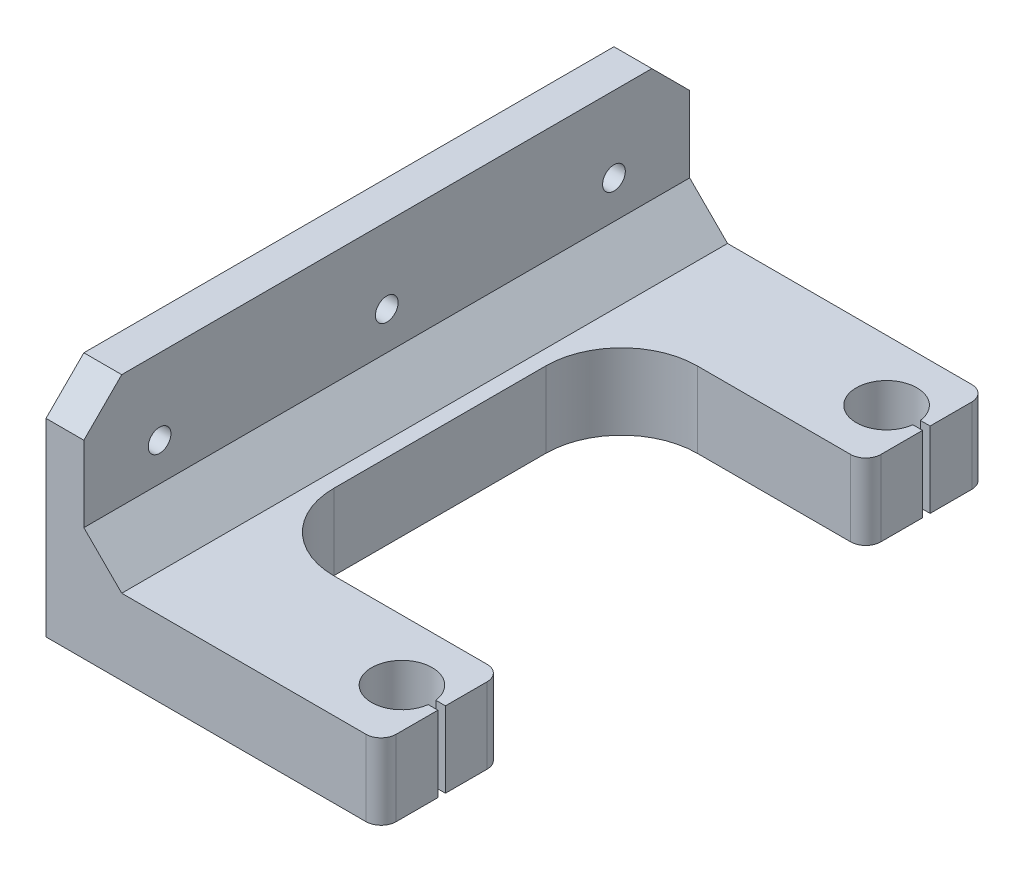
ISO-10303-21;
HEADER;
FILE_DESCRIPTION(('STEP AP214'),'2;1');
FILE_NAME('part.step','',(''),(''),'','','');
FILE_SCHEMA(('AUTOMOTIVE_DESIGN { 1 0 10303 214 1 1 1 1 }'));
ENDSEC;
DATA;
#1=APPLICATION_CONTEXT('core data for automotive mechanical design processes');
#2=APPLICATION_PROTOCOL_DEFINITION('international standard','automotive_design',2000,#1);
#3=PRODUCT_CONTEXT('',#1,'mechanical');
#4=PRODUCT('Part','Part','',(#3));
#5=PRODUCT_RELATED_PRODUCT_CATEGORY('part','',(#4));
#6=PRODUCT_DEFINITION_FORMATION('','',#4);
#7=PRODUCT_DEFINITION_CONTEXT('part definition',#1,'design');
#8=PRODUCT_DEFINITION('design','',#6,#7);
#9=PRODUCT_DEFINITION_SHAPE('','',#8);
#10=(LENGTH_UNIT() NAMED_UNIT(*) SI_UNIT(.MILLI.,.METRE.));
#11=(NAMED_UNIT(*) PLANE_ANGLE_UNIT() SI_UNIT($,.RADIAN.));
#12=(NAMED_UNIT(*) SI_UNIT($,.STERADIAN.) SOLID_ANGLE_UNIT());
#13=UNCERTAINTY_MEASURE_WITH_UNIT(LENGTH_MEASURE(1.E-05),#10,'distance_accuracy_value','');
#14=(GEOMETRIC_REPRESENTATION_CONTEXT(3) GLOBAL_UNCERTAINTY_ASSIGNED_CONTEXT((#13)) GLOBAL_UNIT_ASSIGNED_CONTEXT((#10,
#11,#12)) REPRESENTATION_CONTEXT('',''));
#15=CARTESIAN_POINT('',(0.,0.,0.));
#16=DIRECTION('',(0.,0.,1.));
#17=DIRECTION('',(1.,0.,0.));
#18=AXIS2_PLACEMENT_3D('',#15,#16,#17);
#19=CARTESIAN_POINT('',(44.25,10.,80.));
#20=DIRECTION('',(-1.,0.,0.));
#21=DIRECTION('',(0.,0.,1.));
#22=AXIS2_PLACEMENT_3D('',#19,#20,#21);
#23=PLANE('',#22);
#24=DIRECTION('',(0.,0.,-1.));
#25=VECTOR('',#24,1.);
#26=CARTESIAN_POINT('',(44.25,0.,80.));
#27=LINE('',#26,#25);
#28=CARTESIAN_POINT('',(44.25,0.,71.5));
#29=VERTEX_POINT('',#28);
#30=CARTESIAN_POINT('',(44.25,0.,66.));
#31=VERTEX_POINT('',#30);
#32=EDGE_CURVE('E384',#29,#31,#27,.T.);
#33=ORIENTED_EDGE('',*,*,#32,.T.);
#34=DIRECTION('',(0.,-1.,0.));
#35=VECTOR('',#34,1.);
#36=CARTESIAN_POINT('',(44.25,10.,66.));
#37=LINE('',#36,#35);
#38=CARTESIAN_POINT('',(44.25,10.,66.));
#39=VERTEX_POINT('',#38);
#40=EDGE_CURVE('E441',#31,#39,#37,.F.);
#41=ORIENTED_EDGE('',*,*,#40,.T.);
#42=DIRECTION('',(0.,0.,-1.));
#43=VECTOR('',#42,1.);
#44=CARTESIAN_POINT('',(44.25,10.,80.));
#45=LINE('',#44,#43);
#46=CARTESIAN_POINT('',(44.25,10.,71.5));
#47=VERTEX_POINT('',#46);
#48=EDGE_CURVE('E361',#47,#39,#45,.T.);
#49=ORIENTED_EDGE('',*,*,#48,.F.);
#50=DIRECTION('',(0.,1.,0.));
#51=VECTOR('',#50,1.);
#52=CARTESIAN_POINT('',(44.25,0.,71.5));
#53=LINE('',#52,#51);
#54=EDGE_CURVE('E286',#29,#47,#53,.T.);
#55=ORIENTED_EDGE('',*,*,#54,.F.);
#56=EDGE_LOOP('',(#33,#41,#49,#55));
#57=FACE_BOUND('',#56,.T.);
#58=ADVANCED_FACE('F47',(#57),#23,.F.);
#59=CARTESIAN_POINT('',(44.25,10.,16.));
#60=DIRECTION('',(-1.,0.,0.));
#61=DIRECTION('',(0.,0.,1.));
#62=AXIS2_PLACEMENT_3D('',#59,#60,#61);
#63=PLANE('',#62);
#64=DIRECTION('',(0.,0.,-1.));
#65=VECTOR('',#64,1.);
#66=CARTESIAN_POINT('',(44.25,0.,16.));
#67=LINE('',#66,#65);
#68=CARTESIAN_POINT('',(44.25,0.,7.5));
#69=VERTEX_POINT('',#68);
#70=CARTESIAN_POINT('',(44.25,0.,2.));
#71=VERTEX_POINT('',#70);
#72=EDGE_CURVE('E395',#69,#71,#67,.T.);
#73=ORIENTED_EDGE('',*,*,#72,.T.);
#74=DIRECTION('',(0.,-1.,0.));
#75=VECTOR('',#74,1.);
#76=CARTESIAN_POINT('',(44.25,10.,2.));
#77=LINE('',#76,#75);
#78=CARTESIAN_POINT('',(44.25,10.,2.));
#79=VERTEX_POINT('',#78);
#80=EDGE_CURVE('E459',#71,#79,#77,.F.);
#81=ORIENTED_EDGE('',*,*,#80,.T.);
#82=DIRECTION('',(0.,0.,-1.));
#83=VECTOR('',#82,1.);
#84=CARTESIAN_POINT('',(44.25,10.,16.));
#85=LINE('',#84,#83);
#86=CARTESIAN_POINT('',(44.25,10.,7.5));
#87=VERTEX_POINT('',#86);
#88=EDGE_CURVE('E372',#87,#79,#85,.T.);
#89=ORIENTED_EDGE('',*,*,#88,.F.);
#90=DIRECTION('',(0.,1.,0.));
#91=VECTOR('',#90,1.);
#92=CARTESIAN_POINT('',(44.25,0.,7.5));
#93=LINE('',#92,#91);
#94=EDGE_CURVE('E311',#69,#87,#93,.T.);
#95=ORIENTED_EDGE('',*,*,#94,.F.);
#96=EDGE_LOOP('',(#73,#81,#89,#95));
#97=FACE_BOUND('',#96,.T.);
#98=ADVANCED_FACE('F535',(#97),#63,.F.);
#99=CARTESIAN_POINT('',(0.,10.,0.));
#100=DIRECTION('',(0.,1.,0.));
#101=DIRECTION('',(0.,0.,1.));
#102=AXIS2_PLACEMENT_3D('',#99,#100,#101);
#103=PLANE('',#102);
#104=ORIENTED_EDGE('',*,*,#48,.T.);
#105=CARTESIAN_POINT('',(42.25,10.,66.));
#106=DIRECTION('',(0.,1.,0.));
#107=DIRECTION('',(0.,0.,1.));
#108=AXIS2_PLACEMENT_3D('',#105,#106,#107);
#109=CIRCLE('',#108,2.);
#110=CARTESIAN_POINT('',(42.25,10.,64.));
#111=VERTEX_POINT('',#110);
#112=EDGE_CURVE('E449',#39,#111,#109,.T.);
#113=ORIENTED_EDGE('',*,*,#112,.T.);
#114=DIRECTION('',(-1.,0.,0.));
#115=VECTOR('',#114,1.);
#116=CARTESIAN_POINT('',(44.25,10.,64.));
#117=LINE('',#116,#115);
#118=CARTESIAN_POINT('',(22.,10.,64.));
#119=VERTEX_POINT('',#118);
#120=EDGE_CURVE('E364',#111,#119,#117,.T.);
#121=ORIENTED_EDGE('',*,*,#120,.T.);
#122=CARTESIAN_POINT('',(22.,10.,54.));
#123=DIRECTION('',(0.,1.,0.));
#124=DIRECTION('',(0.,0.,1.));
#125=AXIS2_PLACEMENT_3D('',#122,#123,#124);
#126=CIRCLE('',#125,10.);
#127=CARTESIAN_POINT('',(12.,10.,54.));
#128=VERTEX_POINT('',#127);
#129=EDGE_CURVE('E483',#119,#128,#126,.F.);
#130=ORIENTED_EDGE('',*,*,#129,.T.);
#131=DIRECTION('',(0.,0.,-1.));
#132=VECTOR('',#131,1.);
#133=CARTESIAN_POINT('',(12.,10.,64.));
#134=LINE('',#133,#132);
#135=CARTESIAN_POINT('',(12.,10.,26.));
#136=VERTEX_POINT('',#135);
#137=EDGE_CURVE('E367',#128,#136,#134,.T.);
#138=ORIENTED_EDGE('',*,*,#137,.T.);
#139=CARTESIAN_POINT('',(22.,10.,26.));
#140=DIRECTION('',(0.,1.,0.));
#141=DIRECTION('',(0.,0.,1.));
#142=AXIS2_PLACEMENT_3D('',#139,#140,#141);
#143=CIRCLE('',#142,10.);
#144=CARTESIAN_POINT('',(22.,10.,16.));
#145=VERTEX_POINT('',#144);
#146=EDGE_CURVE('E479',#136,#145,#143,.F.);
#147=ORIENTED_EDGE('',*,*,#146,.T.);
#148=DIRECTION('',(1.,0.,0.));
#149=VECTOR('',#148,1.);
#150=CARTESIAN_POINT('',(12.,10.,16.));
#151=LINE('',#150,#149);
#152=CARTESIAN_POINT('',(42.25,10.,16.));
#153=VERTEX_POINT('',#152);
#154=EDGE_CURVE('E370',#145,#153,#151,.T.);
#155=ORIENTED_EDGE('',*,*,#154,.T.);
#156=CARTESIAN_POINT('',(42.25,10.,14.));
#157=DIRECTION('',(0.,1.,0.));
#158=DIRECTION('',(0.,0.,1.));
#159=AXIS2_PLACEMENT_3D('',#156,#157,#158);
#160=CIRCLE('',#159,2.);
#161=CARTESIAN_POINT('',(44.25,10.,14.));
#162=VERTEX_POINT('',#161);
#163=EDGE_CURVE('E443',#153,#162,#160,.T.);
#164=ORIENTED_EDGE('',*,*,#163,.T.);
#165=CARTESIAN_POINT('',(44.25,10.,8.5));
#166=VERTEX_POINT('',#165);
#167=EDGE_CURVE('E373',#162,#166,#85,.T.);
#168=ORIENTED_EDGE('',*,*,#167,.T.);
#169=DIRECTION('',(1.,0.,0.));
#170=VECTOR('',#169,1.);
#171=CARTESIAN_POINT('',(39.,10.,8.5));
#172=LINE('',#171,#170);
#173=CARTESIAN_POINT('',(42.9686269665969,10.,8.5));
#174=VERTEX_POINT('',#173);
#175=EDGE_CURVE('E292',#174,#166,#172,.T.);
#176=ORIENTED_EDGE('',*,*,#175,.F.);
#177=CARTESIAN_POINT('',(39.,10.,8.));
#178=DIRECTION('',(0.,1.,0.));
#179=DIRECTION('',(0.,0.,1.));
#180=AXIS2_PLACEMENT_3D('',#177,#178,#179);
#181=CIRCLE('',#180,4.00000000000001);
#182=CARTESIAN_POINT('',(42.9686269665969,10.,7.5));
#183=VERTEX_POINT('',#182);
#184=EDGE_CURVE('E351',#183,#174,#181,.T.);
#185=ORIENTED_EDGE('',*,*,#184,.F.);
#186=DIRECTION('',(-1.,0.,0.));
#187=VECTOR('',#186,1.);
#188=CARTESIAN_POINT('',(39.,10.,7.5));
#189=LINE('',#188,#187);
#190=EDGE_CURVE('E297',#87,#183,#189,.T.);
#191=ORIENTED_EDGE('',*,*,#190,.F.);
#192=ORIENTED_EDGE('',*,*,#88,.T.);
#193=CARTESIAN_POINT('',(42.25,10.,2.));
#194=DIRECTION('',(0.,1.,0.));
#195=DIRECTION('',(0.,0.,1.));
#196=AXIS2_PLACEMENT_3D('',#193,#194,#195);
#197=CIRCLE('',#196,2.);
#198=CARTESIAN_POINT('',(42.25,10.,0.));
#199=VERTEX_POINT('',#198);
#200=EDGE_CURVE('E445',#79,#199,#197,.T.);
#201=ORIENTED_EDGE('',*,*,#200,.T.);
#202=DIRECTION('',(-1.,0.,0.));
#203=VECTOR('',#202,1.);
#204=CARTESIAN_POINT('',(44.25,10.,0.));
#205=LINE('',#204,#203);
#206=CARTESIAN_POINT('',(9.99999999999999,10.,0.));
#207=VERTEX_POINT('',#206);
#208=EDGE_CURVE('E355',#199,#207,#205,.T.);
#209=ORIENTED_EDGE('',*,*,#208,.T.);
#210=DIRECTION('',(0.,0.,1.));
#211=VECTOR('',#210,1.);
#212=CARTESIAN_POINT('',(9.99999999999999,10.,0.));
#213=LINE('',#212,#211);
#214=CARTESIAN_POINT('',(9.99999999999999,10.,80.));
#215=VERTEX_POINT('',#214);
#216=EDGE_CURVE('E421',#207,#215,#213,.T.);
#217=ORIENTED_EDGE('',*,*,#216,.T.);
#218=DIRECTION('',(1.,0.,0.));
#219=VECTOR('',#218,1.);
#220=CARTESIAN_POINT('',(0.,10.,80.));
#221=LINE('',#220,#219);
#222=CARTESIAN_POINT('',(42.25,10.,80.));
#223=VERTEX_POINT('',#222);
#224=EDGE_CURVE('E357',#215,#223,#221,.T.);
#225=ORIENTED_EDGE('',*,*,#224,.T.);
#226=CARTESIAN_POINT('',(42.25,10.,78.));
#227=DIRECTION('',(0.,1.,0.));
#228=DIRECTION('',(0.,0.,1.));
#229=AXIS2_PLACEMENT_3D('',#226,#227,#228);
#230=CIRCLE('',#229,2.);
#231=CARTESIAN_POINT('',(44.25,10.,78.));
#232=VERTEX_POINT('',#231);
#233=EDGE_CURVE('E447',#223,#232,#230,.T.);
#234=ORIENTED_EDGE('',*,*,#233,.T.);
#235=CARTESIAN_POINT('',(44.25,10.,72.5));
#236=VERTEX_POINT('',#235);
#237=EDGE_CURVE('E362',#232,#236,#45,.T.);
#238=ORIENTED_EDGE('',*,*,#237,.T.);
#239=DIRECTION('',(1.,0.,0.));
#240=VECTOR('',#239,1.);
#241=CARTESIAN_POINT('',(39.,10.,72.5));
#242=LINE('',#241,#240);
#243=CARTESIAN_POINT('',(42.9686269665969,10.,72.5));
#244=VERTEX_POINT('',#243);
#245=EDGE_CURVE('E278',#244,#236,#242,.T.);
#246=ORIENTED_EDGE('',*,*,#245,.F.);
#247=CARTESIAN_POINT('',(39.,10.,72.));
#248=DIRECTION('',(0.,1.,0.));
#249=DIRECTION('',(0.,0.,-1.));
#250=AXIS2_PLACEMENT_3D('',#247,#248,#249);
#251=CIRCLE('',#250,4.00000000000001);
#252=CARTESIAN_POINT('',(42.9686269665969,10.,71.5));
#253=VERTEX_POINT('',#252);
#254=EDGE_CURVE('E348',#253,#244,#251,.T.);
#255=ORIENTED_EDGE('',*,*,#254,.F.);
#256=DIRECTION('',(-1.,0.,0.));
#257=VECTOR('',#256,1.);
#258=CARTESIAN_POINT('',(39.,10.,71.5));
#259=LINE('',#258,#257);
#260=EDGE_CURVE('E276',#47,#253,#259,.T.);
#261=ORIENTED_EDGE('',*,*,#260,.F.);
#262=EDGE_LOOP('',(#104,#113,#121,#130,#138,#147,#155,#164,#168,#176,#185,#191,#192,#201,#209,
#217,#225,#234,#238,#246,#255,#261));
#263=FACE_BOUND('',#262,.T.);
#264=ADVANCED_FACE('F544',(#263),#103,.T.);
#265=CARTESIAN_POINT('',(0.,0.,0.));
#266=DIRECTION('',(0.,1.,0.));
#267=DIRECTION('',(0.,0.,1.));
#268=AXIS2_PLACEMENT_3D('',#265,#266,#267);
#269=PLANE('',#268);
#270=DIRECTION('',(-1.,0.,0.));
#271=VECTOR('',#270,1.);
#272=CARTESIAN_POINT('',(44.25,0.,64.));
#273=LINE('',#272,#271);
#274=CARTESIAN_POINT('',(42.25,0.,64.));
#275=VERTEX_POINT('',#274);
#276=CARTESIAN_POINT('',(22.,0.,64.));
#277=VERTEX_POINT('',#276);
#278=EDGE_CURVE('E387',#275,#277,#273,.T.);
#279=ORIENTED_EDGE('',*,*,#278,.F.);
#280=CARTESIAN_POINT('',(42.25,0.,66.));
#281=DIRECTION('',(0.,1.,0.));
#282=DIRECTION('',(0.,0.,1.));
#283=AXIS2_PLACEMENT_3D('',#280,#281,#282);
#284=CIRCLE('',#283,2.);
#285=EDGE_CURVE('E439',#275,#31,#284,.F.);
#286=ORIENTED_EDGE('',*,*,#285,.T.);
#287=ORIENTED_EDGE('',*,*,#32,.F.);
#288=DIRECTION('',(-1.,0.,0.));
#289=VECTOR('',#288,1.);
#290=CARTESIAN_POINT('',(39.,0.,71.5));
#291=LINE('',#290,#289);
#292=CARTESIAN_POINT('',(39.,0.,71.5));
#293=VERTEX_POINT('',#292);
#294=EDGE_CURVE('E262',#29,#293,#291,.T.);
#295=ORIENTED_EDGE('',*,*,#294,.T.);
#296=CARTESIAN_POINT('',(39.,0.,72.));
#297=DIRECTION('',(0.,1.,0.));
#298=DIRECTION('',(0.,0.,1.));
#299=AXIS2_PLACEMENT_3D('',#296,#297,#298);
#300=CIRCLE('',#299,0.5);
#301=CARTESIAN_POINT('',(39.,0.,72.5));
#302=VERTEX_POINT('',#301);
#303=EDGE_CURVE('E255',#293,#302,#300,.T.);
#304=ORIENTED_EDGE('',*,*,#303,.T.);
#305=DIRECTION('',(1.,0.,0.));
#306=VECTOR('',#305,1.);
#307=CARTESIAN_POINT('',(39.,0.,72.5));
#308=LINE('',#307,#306);
#309=CARTESIAN_POINT('',(44.25,0.,72.5));
#310=VERTEX_POINT('',#309);
#311=EDGE_CURVE('E266',#302,#310,#308,.T.);
#312=ORIENTED_EDGE('',*,*,#311,.T.);
#313=CARTESIAN_POINT('',(44.25,0.,78.));
#314=VERTEX_POINT('',#313);
#315=EDGE_CURVE('E385',#314,#310,#27,.T.);
#316=ORIENTED_EDGE('',*,*,#315,.F.);
#317=CARTESIAN_POINT('',(42.25,0.,78.));
#318=DIRECTION('',(0.,1.,0.));
#319=DIRECTION('',(0.,0.,1.));
#320=AXIS2_PLACEMENT_3D('',#317,#318,#319);
#321=CIRCLE('',#320,2.);
#322=CARTESIAN_POINT('',(42.25,0.,80.));
#323=VERTEX_POINT('',#322);
#324=EDGE_CURVE('E437',#314,#323,#321,.F.);
#325=ORIENTED_EDGE('',*,*,#324,.T.);
#326=DIRECTION('',(1.,0.,0.));
#327=VECTOR('',#326,1.);
#328=CARTESIAN_POINT('',(0.,0.,80.));
#329=LINE('',#328,#327);
#330=CARTESIAN_POINT('',(0.,0.,80.));
#331=VERTEX_POINT('',#330);
#332=EDGE_CURVE('E381',#331,#323,#329,.T.);
#333=ORIENTED_EDGE('',*,*,#332,.F.);
#334=DIRECTION('',(0.,0.,1.));
#335=VECTOR('',#334,1.);
#336=CARTESIAN_POINT('',(0.,0.,0.));
#337=LINE('',#336,#335);
#338=CARTESIAN_POINT('',(0.,0.,0.));
#339=VERTEX_POINT('',#338);
#340=EDGE_CURVE('E378',#339,#331,#337,.T.);
#341=ORIENTED_EDGE('',*,*,#340,.F.);
#342=DIRECTION('',(-1.,0.,0.));
#343=VECTOR('',#342,1.);
#344=CARTESIAN_POINT('',(44.25,0.,0.));
#345=LINE('',#344,#343);
#346=CARTESIAN_POINT('',(42.25,0.,0.));
#347=VERTEX_POINT('',#346);
#348=EDGE_CURVE('E354',#347,#339,#345,.T.);
#349=ORIENTED_EDGE('',*,*,#348,.F.);
#350=CARTESIAN_POINT('',(42.25,0.,2.));
#351=DIRECTION('',(0.,1.,0.));
#352=DIRECTION('',(0.,0.,1.));
#353=AXIS2_PLACEMENT_3D('',#350,#351,#352);
#354=CIRCLE('',#353,2.);
#355=EDGE_CURVE('E435',#347,#71,#354,.F.);
#356=ORIENTED_EDGE('',*,*,#355,.T.);
#357=ORIENTED_EDGE('',*,*,#72,.F.);
#358=DIRECTION('',(-1.,0.,0.));
#359=VECTOR('',#358,1.);
#360=CARTESIAN_POINT('',(39.,0.,7.5));
#361=LINE('',#360,#359);
#362=CARTESIAN_POINT('',(39.,0.,7.5));
#363=VERTEX_POINT('',#362);
#364=EDGE_CURVE('E300',#69,#363,#361,.T.);
#365=ORIENTED_EDGE('',*,*,#364,.T.);
#366=CARTESIAN_POINT('',(39.,0.,8.));
#367=DIRECTION('',(0.,1.,0.));
#368=DIRECTION('',(0.,0.,1.));
#369=AXIS2_PLACEMENT_3D('',#366,#367,#368);
#370=CIRCLE('',#369,0.5);
#371=CARTESIAN_POINT('',(39.,0.,8.5));
#372=VERTEX_POINT('',#371);
#373=EDGE_CURVE('E293',#363,#372,#370,.T.);
#374=ORIENTED_EDGE('',*,*,#373,.T.);
#375=DIRECTION('',(1.,0.,0.));
#376=VECTOR('',#375,1.);
#377=CARTESIAN_POINT('',(39.,0.,8.5));
#378=LINE('',#377,#376);
#379=CARTESIAN_POINT('',(44.25,0.,8.5));
#380=VERTEX_POINT('',#379);
#381=EDGE_CURVE('E296',#372,#380,#378,.T.);
#382=ORIENTED_EDGE('',*,*,#381,.T.);
#383=CARTESIAN_POINT('',(44.25,0.,14.));
#384=VERTEX_POINT('',#383);
#385=EDGE_CURVE('E358',#384,#380,#67,.T.);
#386=ORIENTED_EDGE('',*,*,#385,.F.);
#387=CARTESIAN_POINT('',(42.25,0.,14.));
#388=DIRECTION('',(0.,1.,0.));
#389=DIRECTION('',(0.,0.,1.));
#390=AXIS2_PLACEMENT_3D('',#387,#388,#389);
#391=CIRCLE('',#390,2.);
#392=CARTESIAN_POINT('',(42.25,0.,16.));
#393=VERTEX_POINT('',#392);
#394=EDGE_CURVE('E432',#384,#393,#391,.F.);
#395=ORIENTED_EDGE('',*,*,#394,.T.);
#396=DIRECTION('',(1.,0.,0.));
#397=VECTOR('',#396,1.);
#398=CARTESIAN_POINT('',(12.,0.,16.));
#399=LINE('',#398,#397);
#400=CARTESIAN_POINT('',(22.,0.,16.));
#401=VERTEX_POINT('',#400);
#402=EDGE_CURVE('E393',#401,#393,#399,.T.);
#403=ORIENTED_EDGE('',*,*,#402,.F.);
#404=CARTESIAN_POINT('',(22.,0.,26.));
#405=DIRECTION('',(0.,1.,0.));
#406=DIRECTION('',(0.,0.,1.));
#407=AXIS2_PLACEMENT_3D('',#404,#405,#406);
#408=CIRCLE('',#407,10.);
#409=CARTESIAN_POINT('',(12.,0.,26.));
#410=VERTEX_POINT('',#409);
#411=EDGE_CURVE('E477',#401,#410,#408,.T.);
#412=ORIENTED_EDGE('',*,*,#411,.T.);
#413=DIRECTION('',(0.,0.,-1.));
#414=VECTOR('',#413,1.);
#415=CARTESIAN_POINT('',(12.,0.,64.));
#416=LINE('',#415,#414);
#417=CARTESIAN_POINT('',(12.,0.,54.));
#418=VERTEX_POINT('',#417);
#419=EDGE_CURVE('E390',#418,#410,#416,.T.);
#420=ORIENTED_EDGE('',*,*,#419,.F.);
#421=CARTESIAN_POINT('',(22.,0.,54.));
#422=DIRECTION('',(0.,1.,0.));
#423=DIRECTION('',(0.,0.,1.));
#424=AXIS2_PLACEMENT_3D('',#421,#422,#423);
#425=CIRCLE('',#424,10.);
#426=EDGE_CURVE('E481',#418,#277,#425,.T.);
#427=ORIENTED_EDGE('',*,*,#426,.T.);
#428=EDGE_LOOP('',(#279,#286,#287,#295,#304,#312,#316,#325,#333,#341,#349,#356,#357,#365,#374,
#382,#386,#395,#403,#412,#420,#427));
#429=FACE_BOUND('',#428,.T.);
#430=ADVANCED_FACE('F274',(#429),#269,.F.);
#431=CARTESIAN_POINT('',(44.25,10.,0.));
#432=DIRECTION('',(0.,0.,1.));
#433=DIRECTION('',(1.,0.,0.));
#434=AXIS2_PLACEMENT_3D('',#431,#432,#433);
#435=PLANE('',#434);
#436=DIRECTION('',(0.,-1.,0.));
#437=VECTOR('',#436,1.);
#438=CARTESIAN_POINT('',(0.,10.,0.));
#439=LINE('',#438,#437);
#440=CARTESIAN_POINT('',(0.,25.,0.));
#441=VERTEX_POINT('',#440);
#442=EDGE_CURVE('E398',#441,#339,#439,.T.);
#443=ORIENTED_EDGE('',*,*,#442,.F.);
#444=DIRECTION('',(1.,0.,0.));
#445=VECTOR('',#444,1.);
#446=CARTESIAN_POINT('',(44.25,25.,0.));
#447=LINE('',#446,#445);
#448=CARTESIAN_POINT('',(5.,25.,0.));
#449=VERTEX_POINT('',#448);
#450=EDGE_CURVE('E70',#441,#449,#447,.T.);
#451=ORIENTED_EDGE('',*,*,#450,.T.);
#452=DIRECTION('',(0.,-1.,0.));
#453=VECTOR('',#452,1.);
#454=CARTESIAN_POINT('',(5.,30.,0.));
#455=LINE('',#454,#453);
#456=CARTESIAN_POINT('',(5.,15.,0.));
#457=VERTEX_POINT('',#456);
#458=EDGE_CURVE('E344',#449,#457,#455,.T.);
#459=ORIENTED_EDGE('',*,*,#458,.T.);
#460=DIRECTION('',(0.707106781186545,-0.70710678118655,0.));
#461=VECTOR('',#460,1.);
#462=CARTESIAN_POINT('',(27.1249999999998,-7.12500000000001,0.));
#463=LINE('',#462,#461);
#464=EDGE_CURVE('E423',#457,#207,#463,.T.);
#465=ORIENTED_EDGE('',*,*,#464,.T.);
#466=ORIENTED_EDGE('',*,*,#208,.F.);
#467=DIRECTION('',(0.,-1.,0.));
#468=VECTOR('',#467,1.);
#469=CARTESIAN_POINT('',(42.25,10.,0.));
#470=LINE('',#469,#468);
#471=EDGE_CURVE('E456',#199,#347,#470,.T.);
#472=ORIENTED_EDGE('',*,*,#471,.T.);
#473=ORIENTED_EDGE('',*,*,#348,.T.);
#474=EDGE_LOOP('',(#443,#451,#459,#465,#466,#472,#473));
#475=FACE_BOUND('',#474,.T.);
#476=ADVANCED_FACE('F507',(#475),#435,.F.);
#477=CARTESIAN_POINT('',(0.,10.,0.));
#478=DIRECTION('',(1.,0.,0.));
#479=DIRECTION('',(0.,0.,-1.));
#480=AXIS2_PLACEMENT_3D('',#477,#478,#479);
#481=PLANE('',#480);
#482=CARTESIAN_POINT('',(0.,20.,40.));
#483=DIRECTION('',(1.,0.,0.));
#484=DIRECTION('',(0.,0.,-1.));
#485=AXIS2_PLACEMENT_3D('',#482,#483,#484);
#486=CIRCLE('',#485,1.5);
#487=CARTESIAN_POINT('',(0.,20.,38.5));
#488=VERTEX_POINT('',#487);
#489=EDGE_CURVE('E321',#488,#488,#486,.T.);
#490=ORIENTED_EDGE('',*,*,#489,.T.);
#491=EDGE_LOOP('',(#490));
#492=FACE_BOUND('',#491,.T.);
#493=CARTESIAN_POINT('',(0.,20.,10.));
#494=DIRECTION('',(1.,0.,0.));
#495=DIRECTION('',(0.,0.,-1.));
#496=AXIS2_PLACEMENT_3D('',#493,#494,#495);
#497=CIRCLE('',#496,1.5);
#498=CARTESIAN_POINT('',(0.,20.,8.5));
#499=VERTEX_POINT('',#498);
#500=EDGE_CURVE('E328',#499,#499,#497,.T.);
#501=ORIENTED_EDGE('',*,*,#500,.T.);
#502=EDGE_LOOP('',(#501));
#503=FACE_BOUND('',#502,.T.);
#504=CARTESIAN_POINT('',(0.,20.,70.));
#505=DIRECTION('',(1.,0.,0.));
#506=DIRECTION('',(0.,0.,-1.));
#507=AXIS2_PLACEMENT_3D('',#504,#505,#506);
#508=CIRCLE('',#507,1.5);
#509=CARTESIAN_POINT('',(0.,20.,68.5));
#510=VERTEX_POINT('',#509);
#511=EDGE_CURVE('E333',#510,#510,#508,.T.);
#512=ORIENTED_EDGE('',*,*,#511,.T.);
#513=EDGE_LOOP('',(#512));
#514=FACE_BOUND('',#513,.T.);
#515=DIRECTION('',(0.,0.,1.));
#516=VECTOR('',#515,1.);
#517=CARTESIAN_POINT('',(0.,30.,80.));
#518=LINE('',#517,#516);
#519=CARTESIAN_POINT('',(0.,30.,5.));
#520=VERTEX_POINT('',#519);
#521=CARTESIAN_POINT('',(0.,30.,75.));
#522=VERTEX_POINT('',#521);
#523=EDGE_CURVE('E336',#520,#522,#518,.T.);
#524=ORIENTED_EDGE('',*,*,#523,.F.);
#525=DIRECTION('',(0.,0.707106781186549,0.707106781186547));
#526=VECTOR('',#525,1.);
#527=CARTESIAN_POINT('',(0.,30.,5.));
#528=LINE('',#527,#526);
#529=EDGE_CURVE('E493',#520,#441,#528,.F.);
#530=ORIENTED_EDGE('',*,*,#529,.T.);
#531=ORIENTED_EDGE('',*,*,#442,.T.);
#532=ORIENTED_EDGE('',*,*,#340,.T.);
#533=DIRECTION('',(0.,-1.,0.));
#534=VECTOR('',#533,1.);
#535=CARTESIAN_POINT('',(0.,10.,80.));
#536=LINE('',#535,#534);
#537=CARTESIAN_POINT('',(0.,25.,80.));
#538=VERTEX_POINT('',#537);
#539=EDGE_CURVE('E375',#538,#331,#536,.T.);
#540=ORIENTED_EDGE('',*,*,#539,.F.);
#541=DIRECTION('',(0.,-0.707106781186549,0.707106781186547));
#542=VECTOR('',#541,1.);
#543=CARTESIAN_POINT('',(0.,30.,75.));
#544=LINE('',#543,#542);
#545=EDGE_CURVE('E491',#538,#522,#544,.F.);
#546=ORIENTED_EDGE('',*,*,#545,.T.);
#547=EDGE_LOOP('',(#524,#530,#531,#532,#540,#546));
#548=FACE_BOUND('',#547,.T.);
#549=ADVANCED_FACE('F506',(#492,#503,#514,#548),#481,.F.);
#550=CARTESIAN_POINT('',(0.,10.,80.));
#551=DIRECTION('',(0.,0.,-1.));
#552=DIRECTION('',(-1.,0.,0.));
#553=AXIS2_PLACEMENT_3D('',#550,#551,#552);
#554=PLANE('',#553);
#555=DIRECTION('',(0.,-1.,0.));
#556=VECTOR('',#555,1.);
#557=CARTESIAN_POINT('',(5.,30.,80.));
#558=LINE('',#557,#556);
#559=CARTESIAN_POINT('',(5.,25.,80.));
#560=VERTEX_POINT('',#559);
#561=CARTESIAN_POINT('',(5.,15.,80.));
#562=VERTEX_POINT('',#561);
#563=EDGE_CURVE('E346',#560,#562,#558,.T.);
#564=ORIENTED_EDGE('',*,*,#563,.F.);
#565=DIRECTION('',(-1.,0.,0.));
#566=VECTOR('',#565,1.);
#567=CARTESIAN_POINT('',(0.,25.,80.));
#568=LINE('',#567,#566);
#569=EDGE_CURVE('E13',#560,#538,#568,.T.);
#570=ORIENTED_EDGE('',*,*,#569,.T.);
#571=ORIENTED_EDGE('',*,*,#539,.T.);
#572=ORIENTED_EDGE('',*,*,#332,.T.);
#573=DIRECTION('',(0.,-1.,0.));
#574=VECTOR('',#573,1.);
#575=CARTESIAN_POINT('',(42.25,10.,80.));
#576=LINE('',#575,#574);
#577=EDGE_CURVE('E454',#323,#223,#576,.F.);
#578=ORIENTED_EDGE('',*,*,#577,.T.);
#579=ORIENTED_EDGE('',*,*,#224,.F.);
#580=DIRECTION('',(-0.707106781186545,0.70710678118655,0.));
#581=VECTOR('',#580,1.);
#582=CARTESIAN_POINT('',(5.00000000000004,15.,80.));
#583=LINE('',#582,#581);
#584=EDGE_CURVE('E426',#215,#562,#583,.T.);
#585=ORIENTED_EDGE('',*,*,#584,.T.);
#586=EDGE_LOOP('',(#564,#570,#571,#572,#578,#579,#585));
#587=FACE_BOUND('',#586,.T.);
#588=ADVANCED_FACE('F518',(#587),#554,.F.);
#589=ORIENTED_EDGE('',*,*,#237,.F.);
#590=DIRECTION('',(0.,-1.,0.));
#591=VECTOR('',#590,1.);
#592=CARTESIAN_POINT('',(44.25,10.,78.));
#593=LINE('',#592,#591);
#594=EDGE_CURVE('E451',#232,#314,#593,.T.);
#595=ORIENTED_EDGE('',*,*,#594,.T.);
#596=ORIENTED_EDGE('',*,*,#315,.T.);
#597=DIRECTION('',(0.,1.,0.));
#598=VECTOR('',#597,1.);
#599=CARTESIAN_POINT('',(44.25,0.,72.5));
#600=LINE('',#599,#598);
#601=EDGE_CURVE('E261',#310,#236,#600,.T.);
#602=ORIENTED_EDGE('',*,*,#601,.T.);
#603=EDGE_LOOP('',(#589,#595,#596,#602));
#604=FACE_BOUND('',#603,.T.);
#605=ADVANCED_FACE('F616',(#604),#23,.F.);
#606=CARTESIAN_POINT('',(44.25,10.,64.));
#607=DIRECTION('',(0.,0.,1.));
#608=DIRECTION('',(1.,0.,0.));
#609=AXIS2_PLACEMENT_3D('',#606,#607,#608);
#610=PLANE('',#609);
#611=ORIENTED_EDGE('',*,*,#278,.T.);
#612=DIRECTION('',(0.,-1.,0.));
#613=VECTOR('',#612,1.);
#614=CARTESIAN_POINT('',(22.,10.,64.));
#615=LINE('',#614,#613);
#616=EDGE_CURVE('E475',#277,#119,#615,.F.);
#617=ORIENTED_EDGE('',*,*,#616,.T.);
#618=ORIENTED_EDGE('',*,*,#120,.F.);
#619=DIRECTION('',(0.,-1.,0.));
#620=VECTOR('',#619,1.);
#621=CARTESIAN_POINT('',(42.25,10.,64.));
#622=LINE('',#621,#620);
#623=EDGE_CURVE('E429',#111,#275,#622,.T.);
#624=ORIENTED_EDGE('',*,*,#623,.T.);
#625=EDGE_LOOP('',(#611,#617,#618,#624));
#626=FACE_BOUND('',#625,.T.);
#627=ADVANCED_FACE('F591',(#626),#610,.F.);
#628=CARTESIAN_POINT('',(12.,10.,64.));
#629=DIRECTION('',(-1.,0.,0.));
#630=DIRECTION('',(0.,0.,1.));
#631=AXIS2_PLACEMENT_3D('',#628,#629,#630);
#632=PLANE('',#631);
#633=ORIENTED_EDGE('',*,*,#419,.T.);
#634=DIRECTION('',(0.,-1.,0.));
#635=VECTOR('',#634,1.);
#636=CARTESIAN_POINT('',(12.,10.,26.));
#637=LINE('',#636,#635);
#638=EDGE_CURVE('E473',#410,#136,#637,.F.);
#639=ORIENTED_EDGE('',*,*,#638,.T.);
#640=ORIENTED_EDGE('',*,*,#137,.F.);
#641=DIRECTION('',(0.,-1.,0.));
#642=VECTOR('',#641,1.);
#643=CARTESIAN_POINT('',(12.,0.,54.));
#644=LINE('',#643,#642);
#645=EDGE_CURVE('E470',#128,#418,#644,.T.);
#646=ORIENTED_EDGE('',*,*,#645,.T.);
#647=EDGE_LOOP('',(#633,#639,#640,#646));
#648=FACE_BOUND('',#647,.T.);
#649=ADVANCED_FACE('F583',(#648),#632,.F.);
#650=CARTESIAN_POINT('',(12.,10.,16.));
#651=DIRECTION('',(0.,0.,-1.));
#652=DIRECTION('',(-1.,0.,0.));
#653=AXIS2_PLACEMENT_3D('',#650,#651,#652);
#654=PLANE('',#653);
#655=ORIENTED_EDGE('',*,*,#154,.F.);
#656=DIRECTION('',(0.,-1.,0.));
#657=VECTOR('',#656,1.);
#658=CARTESIAN_POINT('',(22.,0.,16.));
#659=LINE('',#658,#657);
#660=EDGE_CURVE('E467',#145,#401,#659,.T.);
#661=ORIENTED_EDGE('',*,*,#660,.T.);
#662=ORIENTED_EDGE('',*,*,#402,.T.);
#663=DIRECTION('',(0.,-1.,0.));
#664=VECTOR('',#663,1.);
#665=CARTESIAN_POINT('',(42.25,10.,16.));
#666=LINE('',#665,#664);
#667=EDGE_CURVE('E464',#393,#153,#666,.F.);
#668=ORIENTED_EDGE('',*,*,#667,.T.);
#669=EDGE_LOOP('',(#655,#661,#662,#668));
#670=FACE_BOUND('',#669,.T.);
#671=ADVANCED_FACE('F575',(#670),#654,.F.);
#672=ORIENTED_EDGE('',*,*,#167,.F.);
#673=DIRECTION('',(0.,-1.,0.));
#674=VECTOR('',#673,1.);
#675=CARTESIAN_POINT('',(44.25,10.,14.));
#676=LINE('',#675,#674);
#677=EDGE_CURVE('E461',#162,#384,#676,.T.);
#678=ORIENTED_EDGE('',*,*,#677,.T.);
#679=ORIENTED_EDGE('',*,*,#385,.T.);
#680=DIRECTION('',(0.,1.,0.));
#681=VECTOR('',#680,1.);
#682=CARTESIAN_POINT('',(44.25,0.,8.5));
#683=LINE('',#682,#681);
#684=EDGE_CURVE('E313',#380,#166,#683,.T.);
#685=ORIENTED_EDGE('',*,*,#684,.T.);
#686=EDGE_LOOP('',(#672,#678,#679,#685));
#687=FACE_BOUND('',#686,.T.);
#688=ADVANCED_FACE('F565',(#687),#63,.F.);
#689=CARTESIAN_POINT('',(39.,10.,8.));
#690=DIRECTION('',(0.,-1.,0.));
#691=DIRECTION('',(0.,0.,-1.));
#692=AXIS2_PLACEMENT_3D('',#689,#690,#691);
#693=CYLINDRICAL_SURFACE('',#692,4.00000000000001);
#694=DIRECTION('',(0.,-1.,0.));
#695=VECTOR('',#694,1.);
#696=CARTESIAN_POINT('',(42.9686269665969,10.,7.5));
#697=LINE('',#696,#695);
#698=CARTESIAN_POINT('',(42.9686269665969,2.,7.5));
#699=VERTEX_POINT('',#698);
#700=EDGE_CURVE('E318',#183,#699,#697,.T.);
#701=ORIENTED_EDGE('',*,*,#700,.F.);
#702=ORIENTED_EDGE('',*,*,#184,.T.);
#703=DIRECTION('',(0.,-1.,0.));
#704=VECTOR('',#703,1.);
#705=CARTESIAN_POINT('',(42.9686269665969,10.,8.5));
#706=LINE('',#705,#704);
#707=CARTESIAN_POINT('',(42.9686269665969,2.,8.5));
#708=VERTEX_POINT('',#707);
#709=EDGE_CURVE('E310',#708,#174,#706,.F.);
#710=ORIENTED_EDGE('',*,*,#709,.F.);
#711=CARTESIAN_POINT('',(39.,2.,8.));
#712=DIRECTION('',(0.,1.,0.));
#713=DIRECTION('',(0.,0.,1.));
#714=AXIS2_PLACEMENT_3D('',#711,#712,#713);
#715=CIRCLE('',#714,4.00000000000001);
#716=EDGE_CURVE('E403',#699,#708,#715,.T.);
#717=ORIENTED_EDGE('',*,*,#716,.F.);
#718=EDGE_LOOP('',(#701,#702,#710,#717));
#719=FACE_BOUND('',#718,.T.);
#720=ADVANCED_FACE('F548',(#719),#693,.F.);
#721=CARTESIAN_POINT('',(39.,10.,72.));
#722=DIRECTION('',(0.,-1.,0.));
#723=DIRECTION('',(0.,0.,-1.));
#724=AXIS2_PLACEMENT_3D('',#721,#722,#723);
#725=CYLINDRICAL_SURFACE('',#724,4.00000000000001);
#726=DIRECTION('',(0.,-1.,0.));
#727=VECTOR('',#726,1.);
#728=CARTESIAN_POINT('',(42.9686269665969,10.,71.5));
#729=LINE('',#728,#727);
#730=CARTESIAN_POINT('',(42.9686269665969,2.,71.5));
#731=VERTEX_POINT('',#730);
#732=EDGE_CURVE('E290',#253,#731,#729,.T.);
#733=ORIENTED_EDGE('',*,*,#732,.F.);
#734=ORIENTED_EDGE('',*,*,#254,.T.);
#735=DIRECTION('',(0.,-1.,0.));
#736=VECTOR('',#735,1.);
#737=CARTESIAN_POINT('',(42.9686269665969,10.,72.5));
#738=LINE('',#737,#736);
#739=CARTESIAN_POINT('',(42.9686269665969,2.,72.5));
#740=VERTEX_POINT('',#739);
#741=EDGE_CURVE('E285',#740,#244,#738,.F.);
#742=ORIENTED_EDGE('',*,*,#741,.F.);
#743=CARTESIAN_POINT('',(39.,2.,72.));
#744=DIRECTION('',(0.,1.,0.));
#745=DIRECTION('',(0.,0.,1.));
#746=AXIS2_PLACEMENT_3D('',#743,#744,#745);
#747=CIRCLE('',#746,4.00000000000001);
#748=EDGE_CURVE('E400',#731,#740,#747,.T.);
#749=ORIENTED_EDGE('',*,*,#748,.F.);
#750=EDGE_LOOP('',(#733,#734,#742,#749));
#751=FACE_BOUND('',#750,.T.);
#752=ADVANCED_FACE('F609',(#751),#725,.F.);
#753=CARTESIAN_POINT('',(5.,30.,80.));
#754=DIRECTION('',(-1.,0.,0.));
#755=DIRECTION('',(0.,0.,1.));
#756=AXIS2_PLACEMENT_3D('',#753,#754,#755);
#757=PLANE('',#756);
#758=CARTESIAN_POINT('',(5.,20.,40.));
#759=DIRECTION('',(1.,0.,0.));
#760=DIRECTION('',(0.,0.,-1.));
#761=AXIS2_PLACEMENT_3D('',#758,#759,#760);
#762=CIRCLE('',#761,1.5);
#763=CARTESIAN_POINT('',(5.,20.,38.5));
#764=VERTEX_POINT('',#763);
#765=EDGE_CURVE('E325',#764,#764,#762,.T.);
#766=ORIENTED_EDGE('',*,*,#765,.F.);
#767=EDGE_LOOP('',(#766));
#768=FACE_BOUND('',#767,.T.);
#769=CARTESIAN_POINT('',(5.,20.,10.));
#770=DIRECTION('',(1.,0.,0.));
#771=DIRECTION('',(0.,0.,-1.));
#772=AXIS2_PLACEMENT_3D('',#769,#770,#771);
#773=CIRCLE('',#772,1.5);
#774=CARTESIAN_POINT('',(5.,20.,8.5));
#775=VERTEX_POINT('',#774);
#776=EDGE_CURVE('E320',#775,#775,#773,.T.);
#777=ORIENTED_EDGE('',*,*,#776,.F.);
#778=EDGE_LOOP('',(#777));
#779=FACE_BOUND('',#778,.T.);
#780=CARTESIAN_POINT('',(5.,20.,70.));
#781=DIRECTION('',(1.,0.,0.));
#782=DIRECTION('',(0.,0.,-1.));
#783=AXIS2_PLACEMENT_3D('',#780,#781,#782);
#784=CIRCLE('',#783,1.5);
#785=CARTESIAN_POINT('',(5.,20.,68.5));
#786=VERTEX_POINT('',#785);
#787=EDGE_CURVE('E324',#786,#786,#784,.T.);
#788=ORIENTED_EDGE('',*,*,#787,.F.);
#789=EDGE_LOOP('',(#788));
#790=FACE_BOUND('',#789,.T.);
#791=ORIENTED_EDGE('',*,*,#458,.F.);
#792=DIRECTION('',(0.,-0.707106781186549,-0.707106781186547));
#793=VECTOR('',#792,1.);
#794=CARTESIAN_POINT('',(5.,30.,5.));
#795=LINE('',#794,#793);
#796=CARTESIAN_POINT('',(5.,30.,5.));
#797=VERTEX_POINT('',#796);
#798=EDGE_CURVE('E55',#449,#797,#795,.F.);
#799=ORIENTED_EDGE('',*,*,#798,.T.);
#800=DIRECTION('',(0.,0.,-1.));
#801=VECTOR('',#800,1.);
#802=CARTESIAN_POINT('',(5.,30.,80.));
#803=LINE('',#802,#801);
#804=CARTESIAN_POINT('',(5.,30.,75.));
#805=VERTEX_POINT('',#804);
#806=EDGE_CURVE('E341',#805,#797,#803,.T.);
#807=ORIENTED_EDGE('',*,*,#806,.F.);
#808=DIRECTION('',(0.,0.707106781186549,-0.707106781186547));
#809=VECTOR('',#808,1.);
#810=CARTESIAN_POINT('',(5.,30.,75.));
#811=LINE('',#810,#809);
#812=EDGE_CURVE('E62',#805,#560,#811,.F.);
#813=ORIENTED_EDGE('',*,*,#812,.T.);
#814=ORIENTED_EDGE('',*,*,#563,.T.);
#815=DIRECTION('',(0.,0.,-1.));
#816=VECTOR('',#815,1.);
#817=CARTESIAN_POINT('',(5.,15.,80.));
#818=LINE('',#817,#816);
#819=EDGE_CURVE('E418',#562,#457,#818,.T.);
#820=ORIENTED_EDGE('',*,*,#819,.T.);
#821=EDGE_LOOP('',(#791,#799,#807,#813,#814,#820));
#822=FACE_BOUND('',#821,.T.);
#823=ADVANCED_FACE('F497',(#768,#779,#790,#822),#757,.F.);
#824=CARTESIAN_POINT('',(0.,30.,0.));
#825=DIRECTION('',(0.,-1.,0.));
#826=DIRECTION('',(0.,0.,-1.));
#827=AXIS2_PLACEMENT_3D('',#824,#825,#826);
#828=PLANE('',#827);
#829=ORIENTED_EDGE('',*,*,#806,.T.);
#830=DIRECTION('',(-1.,0.,0.));
#831=VECTOR('',#830,1.);
#832=CARTESIAN_POINT('',(0.,30.,5.));
#833=LINE('',#832,#831);
#834=EDGE_CURVE('E488',#797,#520,#833,.T.);
#835=ORIENTED_EDGE('',*,*,#834,.T.);
#836=ORIENTED_EDGE('',*,*,#523,.T.);
#837=DIRECTION('',(1.,0.,0.));
#838=VECTOR('',#837,1.);
#839=CARTESIAN_POINT('',(0.,30.,75.));
#840=LINE('',#839,#838);
#841=EDGE_CURVE('E485',#522,#805,#840,.T.);
#842=ORIENTED_EDGE('',*,*,#841,.T.);
#843=EDGE_LOOP('',(#829,#835,#836,#842));
#844=FACE_BOUND('',#843,.T.);
#845=ADVANCED_FACE('F501',(#844),#828,.F.);
#846=CARTESIAN_POINT('',(39.,2.,72.));
#847=DIRECTION('',(0.,1.,0.));
#848=DIRECTION('',(0.,0.,1.));
#849=AXIS2_PLACEMENT_3D('',#846,#847,#848);
#850=PLANE('',#849);
#851=DIRECTION('',(-1.,0.,0.));
#852=VECTOR('',#851,1.);
#853=CARTESIAN_POINT('',(39.,2.,71.5));
#854=LINE('',#853,#852);
#855=CARTESIAN_POINT('',(39.,2.,71.5));
#856=VERTEX_POINT('',#855);
#857=EDGE_CURVE('E416',#731,#856,#854,.T.);
#858=ORIENTED_EDGE('',*,*,#857,.F.);
#859=ORIENTED_EDGE('',*,*,#748,.T.);
#860=DIRECTION('',(1.,0.,0.));
#861=VECTOR('',#860,1.);
#862=CARTESIAN_POINT('',(39.,2.,72.5));
#863=LINE('',#862,#861);
#864=CARTESIAN_POINT('',(39.,2.,72.5));
#865=VERTEX_POINT('',#864);
#866=EDGE_CURVE('E413',#865,#740,#863,.T.);
#867=ORIENTED_EDGE('',*,*,#866,.F.);
#868=CARTESIAN_POINT('',(39.,2.,72.));
#869=DIRECTION('',(0.,1.,0.));
#870=DIRECTION('',(0.,0.,1.));
#871=AXIS2_PLACEMENT_3D('',#868,#869,#870);
#872=CIRCLE('',#871,0.5);
#873=EDGE_CURVE('E258',#856,#865,#872,.T.);
#874=ORIENTED_EDGE('',*,*,#873,.F.);
#875=EDGE_LOOP('',(#858,#859,#867,#874));
#876=FACE_BOUND('',#875,.T.);
#877=ADVANCED_FACE('F613',(#876),#850,.T.);
#878=CARTESIAN_POINT('',(39.,2.,8.));
#879=DIRECTION('',(0.,1.,0.));
#880=DIRECTION('',(0.,0.,1.));
#881=AXIS2_PLACEMENT_3D('',#878,#879,#880);
#882=PLANE('',#881);
#883=DIRECTION('',(-1.,0.,0.));
#884=VECTOR('',#883,1.);
#885=CARTESIAN_POINT('',(39.,2.,7.5));
#886=LINE('',#885,#884);
#887=CARTESIAN_POINT('',(39.,2.,7.5));
#888=VERTEX_POINT('',#887);
#889=EDGE_CURVE('E411',#699,#888,#886,.T.);
#890=ORIENTED_EDGE('',*,*,#889,.F.);
#891=ORIENTED_EDGE('',*,*,#716,.T.);
#892=DIRECTION('',(1.,0.,0.));
#893=VECTOR('',#892,1.);
#894=CARTESIAN_POINT('',(39.,2.,8.5));
#895=LINE('',#894,#893);
#896=CARTESIAN_POINT('',(39.,2.,8.5));
#897=VERTEX_POINT('',#896);
#898=EDGE_CURVE('E406',#897,#708,#895,.T.);
#899=ORIENTED_EDGE('',*,*,#898,.F.);
#900=CARTESIAN_POINT('',(39.,2.,8.));
#901=DIRECTION('',(0.,1.,0.));
#902=DIRECTION('',(0.,0.,1.));
#903=AXIS2_PLACEMENT_3D('',#900,#901,#902);
#904=CIRCLE('',#903,0.5);
#905=EDGE_CURVE('E408',#888,#897,#904,.T.);
#906=ORIENTED_EDGE('',*,*,#905,.F.);
#907=EDGE_LOOP('',(#890,#891,#899,#906));
#908=FACE_BOUND('',#907,.T.);
#909=ADVANCED_FACE('F553',(#908),#882,.T.);
#910=CARTESIAN_POINT('',(0.,20.,70.));
#911=DIRECTION('',(1.,0.,0.));
#912=DIRECTION('',(0.,0.,-1.));
#913=AXIS2_PLACEMENT_3D('',#910,#911,#912);
#914=CYLINDRICAL_SURFACE('',#913,1.5);
#915=ORIENTED_EDGE('',*,*,#511,.F.);
#916=EDGE_LOOP('',(#915));
#917=FACE_BOUND('',#916,.T.);
#918=ORIENTED_EDGE('',*,*,#787,.T.);
#919=EDGE_LOOP('',(#918));
#920=FACE_BOUND('',#919,.T.);
#921=ADVANCED_FACE('F676',(#917,#920),#914,.F.);
#922=CARTESIAN_POINT('',(0.,20.,10.));
#923=DIRECTION('',(1.,0.,0.));
#924=DIRECTION('',(0.,0.,-1.));
#925=AXIS2_PLACEMENT_3D('',#922,#923,#924);
#926=CYLINDRICAL_SURFACE('',#925,1.5);
#927=ORIENTED_EDGE('',*,*,#500,.F.);
#928=EDGE_LOOP('',(#927));
#929=FACE_BOUND('',#928,.T.);
#930=ORIENTED_EDGE('',*,*,#776,.T.);
#931=EDGE_LOOP('',(#930));
#932=FACE_BOUND('',#931,.T.);
#933=ADVANCED_FACE('F672',(#929,#932),#926,.F.);
#934=CARTESIAN_POINT('',(0.,20.,40.));
#935=DIRECTION('',(1.,0.,0.));
#936=DIRECTION('',(0.,0.,-1.));
#937=AXIS2_PLACEMENT_3D('',#934,#935,#936);
#938=CYLINDRICAL_SURFACE('',#937,1.5);
#939=ORIENTED_EDGE('',*,*,#489,.F.);
#940=EDGE_LOOP('',(#939));
#941=FACE_BOUND('',#940,.T.);
#942=ORIENTED_EDGE('',*,*,#765,.T.);
#943=EDGE_LOOP('',(#942));
#944=FACE_BOUND('',#943,.T.);
#945=ADVANCED_FACE('F669',(#941,#944),#938,.F.);
#946=CARTESIAN_POINT('',(39.,0.,8.));
#947=DIRECTION('',(0.,1.,0.));
#948=DIRECTION('',(0.,0.,1.));
#949=AXIS2_PLACEMENT_3D('',#946,#947,#948);
#950=CYLINDRICAL_SURFACE('',#949,0.5);
#951=ORIENTED_EDGE('',*,*,#905,.T.);
#952=DIRECTION('',(0.,1.,0.));
#953=VECTOR('',#952,1.);
#954=CARTESIAN_POINT('',(39.,0.,8.5));
#955=LINE('',#954,#953);
#956=EDGE_CURVE('E303',#372,#897,#955,.T.);
#957=ORIENTED_EDGE('',*,*,#956,.F.);
#958=ORIENTED_EDGE('',*,*,#373,.F.);
#959=DIRECTION('',(0.,1.,0.));
#960=VECTOR('',#959,1.);
#961=CARTESIAN_POINT('',(39.,0.,7.5));
#962=LINE('',#961,#960);
#963=EDGE_CURVE('E307',#363,#888,#962,.T.);
#964=ORIENTED_EDGE('',*,*,#963,.T.);
#965=EDGE_LOOP('',(#951,#957,#958,#964));
#966=FACE_BOUND('',#965,.T.);
#967=ADVANCED_FACE('F556',(#966),#950,.F.);
#968=CARTESIAN_POINT('',(39.,0.,7.5));
#969=DIRECTION('',(0.,0.,-1.));
#970=DIRECTION('',(-1.,0.,0.));
#971=AXIS2_PLACEMENT_3D('',#968,#969,#970);
#972=PLANE('',#971);
#973=ORIENTED_EDGE('',*,*,#700,.T.);
#974=ORIENTED_EDGE('',*,*,#889,.T.);
#975=ORIENTED_EDGE('',*,*,#963,.F.);
#976=ORIENTED_EDGE('',*,*,#364,.F.);
#977=ORIENTED_EDGE('',*,*,#94,.T.);
#978=ORIENTED_EDGE('',*,*,#190,.T.);
#979=EDGE_LOOP('',(#973,#974,#975,#976,#977,#978));
#980=FACE_BOUND('',#979,.T.);
#981=ADVANCED_FACE('F540',(#980),#972,.F.);
#982=CARTESIAN_POINT('',(39.,0.,8.5));
#983=DIRECTION('',(0.,0.,1.));
#984=DIRECTION('',(1.,0.,0.));
#985=AXIS2_PLACEMENT_3D('',#982,#983,#984);
#986=PLANE('',#985);
#987=ORIENTED_EDGE('',*,*,#709,.T.);
#988=ORIENTED_EDGE('',*,*,#175,.T.);
#989=ORIENTED_EDGE('',*,*,#684,.F.);
#990=ORIENTED_EDGE('',*,*,#381,.F.);
#991=ORIENTED_EDGE('',*,*,#956,.T.);
#992=ORIENTED_EDGE('',*,*,#898,.T.);
#993=EDGE_LOOP('',(#987,#988,#989,#990,#991,#992));
#994=FACE_BOUND('',#993,.T.);
#995=ADVANCED_FACE('F562',(#994),#986,.F.);
#996=CARTESIAN_POINT('',(39.,0.,72.));
#997=DIRECTION('',(0.,1.,0.));
#998=DIRECTION('',(0.,0.,1.));
#999=AXIS2_PLACEMENT_3D('',#996,#997,#998);
#1000=CYLINDRICAL_SURFACE('',#999,0.5);
#1001=ORIENTED_EDGE('',*,*,#873,.T.);
#1002=DIRECTION('',(0.,1.,0.));
#1003=VECTOR('',#1002,1.);
#1004=CARTESIAN_POINT('',(39.,0.,72.5));
#1005=LINE('',#1004,#1003);
#1006=EDGE_CURVE('E250',#302,#865,#1005,.T.);
#1007=ORIENTED_EDGE('',*,*,#1006,.F.);
#1008=ORIENTED_EDGE('',*,*,#303,.F.);
#1009=DIRECTION('',(0.,1.,0.));
#1010=VECTOR('',#1009,1.);
#1011=CARTESIAN_POINT('',(39.,0.,71.5));
#1012=LINE('',#1011,#1010);
#1013=EDGE_CURVE('E283',#293,#856,#1012,.T.);
#1014=ORIENTED_EDGE('',*,*,#1013,.T.);
#1015=EDGE_LOOP('',(#1001,#1007,#1008,#1014));
#1016=FACE_BOUND('',#1015,.T.);
#1017=ADVANCED_FACE('F252',(#1016),#1000,.F.);
#1018=CARTESIAN_POINT('',(39.,0.,71.5));
#1019=DIRECTION('',(0.,0.,-1.));
#1020=DIRECTION('',(-1.,0.,0.));
#1021=AXIS2_PLACEMENT_3D('',#1018,#1019,#1020);
#1022=PLANE('',#1021);
#1023=ORIENTED_EDGE('',*,*,#732,.T.);
#1024=ORIENTED_EDGE('',*,*,#857,.T.);
#1025=ORIENTED_EDGE('',*,*,#1013,.F.);
#1026=ORIENTED_EDGE('',*,*,#294,.F.);
#1027=ORIENTED_EDGE('',*,*,#54,.T.);
#1028=ORIENTED_EDGE('',*,*,#260,.T.);
#1029=EDGE_LOOP('',(#1023,#1024,#1025,#1026,#1027,#1028));
#1030=FACE_BOUND('',#1029,.T.);
#1031=ADVANCED_FACE('F603',(#1030),#1022,.F.);
#1032=CARTESIAN_POINT('',(39.,0.,72.5));
#1033=DIRECTION('',(0.,0.,1.));
#1034=DIRECTION('',(1.,0.,0.));
#1035=AXIS2_PLACEMENT_3D('',#1032,#1033,#1034);
#1036=PLANE('',#1035);
#1037=ORIENTED_EDGE('',*,*,#741,.T.);
#1038=ORIENTED_EDGE('',*,*,#245,.T.);
#1039=ORIENTED_EDGE('',*,*,#601,.F.);
#1040=ORIENTED_EDGE('',*,*,#311,.F.);
#1041=ORIENTED_EDGE('',*,*,#1006,.T.);
#1042=ORIENTED_EDGE('',*,*,#866,.T.);
#1043=EDGE_LOOP('',(#1037,#1038,#1039,#1040,#1041,#1042));
#1044=FACE_BOUND('',#1043,.T.);
#1045=ADVANCED_FACE('F267',(#1044),#1036,.F.);
#1046=CARTESIAN_POINT('',(5.,15.,80.));
#1047=DIRECTION('',(-0.707106781186551,-0.707106781186545,0.));
#1048=DIRECTION('',(0.,0.,-1.));
#1049=AXIS2_PLACEMENT_3D('',#1046,#1047,#1048);
#1050=PLANE('',#1049);
#1051=ORIENTED_EDGE('',*,*,#584,.F.);
#1052=ORIENTED_EDGE('',*,*,#216,.F.);
#1053=ORIENTED_EDGE('',*,*,#464,.F.);
#1054=ORIENTED_EDGE('',*,*,#819,.F.);
#1055=EDGE_LOOP('',(#1051,#1052,#1053,#1054));
#1056=FACE_BOUND('',#1055,.T.);
#1057=ADVANCED_FACE('F524',(#1056),#1050,.F.);
#1058=CARTESIAN_POINT('',(42.25,10.,66.));
#1059=DIRECTION('',(0.,-1.,0.));
#1060=DIRECTION('',(0.,0.,-1.));
#1061=AXIS2_PLACEMENT_3D('',#1058,#1059,#1060);
#1062=CYLINDRICAL_SURFACE('',#1061,2.);
#1063=ORIENTED_EDGE('',*,*,#112,.F.);
#1064=ORIENTED_EDGE('',*,*,#40,.F.);
#1065=ORIENTED_EDGE('',*,*,#285,.F.);
#1066=ORIENTED_EDGE('',*,*,#623,.F.);
#1067=EDGE_LOOP('',(#1063,#1064,#1065,#1066));
#1068=FACE_BOUND('',#1067,.T.);
#1069=ADVANCED_FACE('F595',(#1068),#1062,.T.);
#1070=CARTESIAN_POINT('',(42.25,10.,78.));
#1071=DIRECTION('',(0.,-1.,0.));
#1072=DIRECTION('',(0.,0.,-1.));
#1073=AXIS2_PLACEMENT_3D('',#1070,#1071,#1072);
#1074=CYLINDRICAL_SURFACE('',#1073,2.);
#1075=ORIENTED_EDGE('',*,*,#233,.F.);
#1076=ORIENTED_EDGE('',*,*,#577,.F.);
#1077=ORIENTED_EDGE('',*,*,#324,.F.);
#1078=ORIENTED_EDGE('',*,*,#594,.F.);
#1079=EDGE_LOOP('',(#1075,#1076,#1077,#1078));
#1080=FACE_BOUND('',#1079,.T.);
#1081=ADVANCED_FACE('F621',(#1080),#1074,.T.);
#1082=CARTESIAN_POINT('',(42.25,10.,2.));
#1083=DIRECTION('',(0.,-1.,0.));
#1084=DIRECTION('',(0.,0.,-1.));
#1085=AXIS2_PLACEMENT_3D('',#1082,#1083,#1084);
#1086=CYLINDRICAL_SURFACE('',#1085,2.);
#1087=ORIENTED_EDGE('',*,*,#200,.F.);
#1088=ORIENTED_EDGE('',*,*,#80,.F.);
#1089=ORIENTED_EDGE('',*,*,#355,.F.);
#1090=ORIENTED_EDGE('',*,*,#471,.F.);
#1091=EDGE_LOOP('',(#1087,#1088,#1089,#1090));
#1092=FACE_BOUND('',#1091,.T.);
#1093=ADVANCED_FACE('F529',(#1092),#1086,.T.);
#1094=CARTESIAN_POINT('',(42.25,10.,14.));
#1095=DIRECTION('',(0.,-1.,0.));
#1096=DIRECTION('',(0.,0.,-1.));
#1097=AXIS2_PLACEMENT_3D('',#1094,#1095,#1096);
#1098=CYLINDRICAL_SURFACE('',#1097,2.);
#1099=ORIENTED_EDGE('',*,*,#163,.F.);
#1100=ORIENTED_EDGE('',*,*,#667,.F.);
#1101=ORIENTED_EDGE('',*,*,#394,.F.);
#1102=ORIENTED_EDGE('',*,*,#677,.F.);
#1103=EDGE_LOOP('',(#1099,#1100,#1101,#1102));
#1104=FACE_BOUND('',#1103,.T.);
#1105=ADVANCED_FACE('F569',(#1104),#1098,.T.);
#1106=CARTESIAN_POINT('',(22.,10.,26.));
#1107=DIRECTION('',(0.,1.,0.));
#1108=DIRECTION('',(0.,0.,1.));
#1109=AXIS2_PLACEMENT_3D('',#1106,#1107,#1108);
#1110=CYLINDRICAL_SURFACE('',#1109,10.);
#1111=ORIENTED_EDGE('',*,*,#146,.F.);
#1112=ORIENTED_EDGE('',*,*,#638,.F.);
#1113=ORIENTED_EDGE('',*,*,#411,.F.);
#1114=ORIENTED_EDGE('',*,*,#660,.F.);
#1115=EDGE_LOOP('',(#1111,#1112,#1113,#1114));
#1116=FACE_BOUND('',#1115,.T.);
#1117=ADVANCED_FACE('F579',(#1116),#1110,.F.);
#1118=CARTESIAN_POINT('',(22.,10.,54.));
#1119=DIRECTION('',(0.,1.,0.));
#1120=DIRECTION('',(0.,0.,1.));
#1121=AXIS2_PLACEMENT_3D('',#1118,#1119,#1120);
#1122=CYLINDRICAL_SURFACE('',#1121,10.);
#1123=ORIENTED_EDGE('',*,*,#129,.F.);
#1124=ORIENTED_EDGE('',*,*,#616,.F.);
#1125=ORIENTED_EDGE('',*,*,#426,.F.);
#1126=ORIENTED_EDGE('',*,*,#645,.F.);
#1127=EDGE_LOOP('',(#1123,#1124,#1125,#1126));
#1128=FACE_BOUND('',#1127,.T.);
#1129=ADVANCED_FACE('F589',(#1128),#1122,.F.);
#1130=CARTESIAN_POINT('',(0.,30.,5.));
#1131=DIRECTION('',(0.,-0.707106781186547,0.707106781186549));
#1132=DIRECTION('',(-1.,0.,0.));
#1133=AXIS2_PLACEMENT_3D('',#1130,#1131,#1132);
#1134=PLANE('',#1133);
#1135=ORIENTED_EDGE('',*,*,#798,.F.);
#1136=ORIENTED_EDGE('',*,*,#450,.F.);
#1137=ORIENTED_EDGE('',*,*,#529,.F.);
#1138=ORIENTED_EDGE('',*,*,#834,.F.);
#1139=EDGE_LOOP('',(#1135,#1136,#1137,#1138));
#1140=FACE_BOUND('',#1139,.T.);
#1141=ADVANCED_FACE('F504',(#1140),#1134,.F.);
#1142=CARTESIAN_POINT('',(0.,30.,75.));
#1143=DIRECTION('',(0.,-0.707106781186547,-0.707106781186549));
#1144=DIRECTION('',(1.,0.,0.));
#1145=AXIS2_PLACEMENT_3D('',#1142,#1143,#1144);
#1146=PLANE('',#1145);
#1147=ORIENTED_EDGE('',*,*,#545,.F.);
#1148=ORIENTED_EDGE('',*,*,#569,.F.);
#1149=ORIENTED_EDGE('',*,*,#812,.F.);
#1150=ORIENTED_EDGE('',*,*,#841,.F.);
#1151=EDGE_LOOP('',(#1147,#1148,#1149,#1150));
#1152=FACE_BOUND('',#1151,.T.);
#1153=ADVANCED_FACE('F49',(#1152),#1146,.F.);
#1154=CLOSED_SHELL('',(#58,#98,#264,#430,#476,#549,#588,#605,#627,#649,#671,#688,#720,#752,#823,
#845,#877,#909,#921,#933,#945,#967,#981,#995,#1017,#1031,#1045,#1057,#1069,#1081,#1093,#1105,
#1117,#1129,#1141,#1153));
#1155=MANIFOLD_SOLID_BREP('B2',#1154);
#1156=ADVANCED_BREP_SHAPE_REPRESENTATION('',(#18,#1155),#14);
#1157=SHAPE_DEFINITION_REPRESENTATION(#9,#1156);
ENDSEC;
END-ISO-10303-21;
